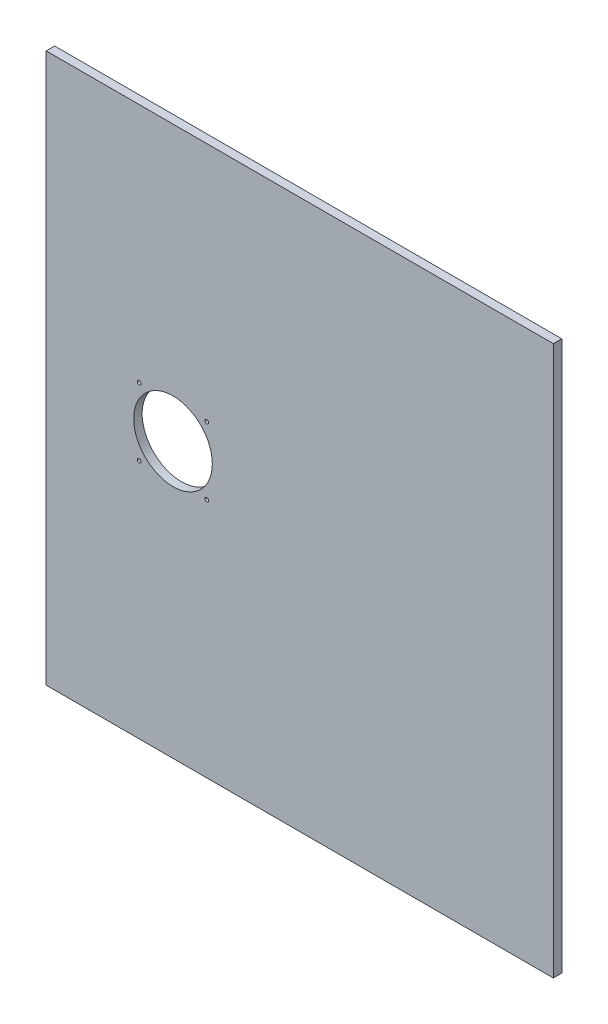
ISO-10303-21;
HEADER;
FILE_DESCRIPTION(('STEP AP214'),'2;1');
FILE_NAME('part.step','',(''),(''),'','','');
FILE_SCHEMA(('AUTOMOTIVE_DESIGN { 1 0 10303 214 1 1 1 1 }'));
ENDSEC;
DATA;
#1=APPLICATION_CONTEXT('core data for automotive mechanical design processes');
#2=APPLICATION_PROTOCOL_DEFINITION('international standard','automotive_design',2000,#1);
#3=PRODUCT_CONTEXT('',#1,'mechanical');
#4=PRODUCT('Part','Part','',(#3));
#5=PRODUCT_RELATED_PRODUCT_CATEGORY('part','',(#4));
#6=PRODUCT_DEFINITION_FORMATION('','',#4);
#7=PRODUCT_DEFINITION_CONTEXT('part definition',#1,'design');
#8=PRODUCT_DEFINITION('design','',#6,#7);
#9=PRODUCT_DEFINITION_SHAPE('','',#8);
#10=(LENGTH_UNIT() NAMED_UNIT(*) SI_UNIT(.MILLI.,.METRE.));
#11=(NAMED_UNIT(*) PLANE_ANGLE_UNIT() SI_UNIT($,.RADIAN.));
#12=(NAMED_UNIT(*) SI_UNIT($,.STERADIAN.) SOLID_ANGLE_UNIT());
#13=UNCERTAINTY_MEASURE_WITH_UNIT(LENGTH_MEASURE(1.E-05),#10,'distance_accuracy_value','');
#14=(GEOMETRIC_REPRESENTATION_CONTEXT(3) GLOBAL_UNCERTAINTY_ASSIGNED_CONTEXT((#13)) GLOBAL_UNIT_ASSIGNED_CONTEXT((#10,
#11,#12)) REPRESENTATION_CONTEXT('',''));
#15=CARTESIAN_POINT('',(0.,0.,0.));
#16=DIRECTION('',(0.,0.,1.));
#17=DIRECTION('',(1.,0.,0.));
#18=AXIS2_PLACEMENT_3D('',#15,#16,#17);
#19=CARTESIAN_POINT('',(0.,0.,10.));
#20=DIRECTION('',(1.,0.,0.));
#21=DIRECTION('',(0.,1.,0.));
#22=AXIS2_PLACEMENT_3D('',#19,#20,#21);
#23=PLANE('',#22);
#24=DIRECTION('',(0.,-1.,0.));
#25=VECTOR('',#24,1.);
#26=CARTESIAN_POINT('',(0.,0.,0.));
#27=LINE('',#26,#25);
#28=CARTESIAN_POINT('',(0.,0.,0.));
#29=VERTEX_POINT('',#28);
#30=CARTESIAN_POINT('',(0.,-650.,0.));
#31=VERTEX_POINT('',#30);
#32=EDGE_CURVE('E96',#29,#31,#27,.T.);
#33=ORIENTED_EDGE('',*,*,#32,.T.);
#34=DIRECTION('',(0.,0.,-1.));
#35=VECTOR('',#34,1.);
#36=CARTESIAN_POINT('',(0.,-650.,10.));
#37=LINE('',#36,#35);
#38=CARTESIAN_POINT('',(0.,-650.,10.));
#39=VERTEX_POINT('',#38);
#40=EDGE_CURVE('E11',#39,#31,#37,.T.);
#41=ORIENTED_EDGE('',*,*,#40,.F.);
#42=DIRECTION('',(0.,-1.,0.));
#43=VECTOR('',#42,1.);
#44=CARTESIAN_POINT('',(0.,0.,10.));
#45=LINE('',#44,#43);
#46=CARTESIAN_POINT('',(0.,0.,10.));
#47=VERTEX_POINT('',#46);
#48=EDGE_CURVE('E84',#47,#39,#45,.T.);
#49=ORIENTED_EDGE('',*,*,#48,.F.);
#50=DIRECTION('',(0.,0.,-1.));
#51=VECTOR('',#50,1.);
#52=CARTESIAN_POINT('',(0.,0.,10.));
#53=LINE('',#52,#51);
#54=EDGE_CURVE('E92',#47,#29,#53,.T.);
#55=ORIENTED_EDGE('',*,*,#54,.T.);
#56=EDGE_LOOP('',(#33,#41,#49,#55));
#57=FACE_BOUND('',#56,.T.);
#58=ADVANCED_FACE('F33',(#57),#23,.F.);
#59=CARTESIAN_POINT('',(0.,-650.,10.));
#60=DIRECTION('',(0.,1.,0.));
#61=DIRECTION('',(0.,0.,1.));
#62=AXIS2_PLACEMENT_3D('',#59,#60,#61);
#63=PLANE('',#62);
#64=DIRECTION('',(1.,0.,0.));
#65=VECTOR('',#64,1.);
#66=CARTESIAN_POINT('',(0.,-650.,0.));
#67=LINE('',#66,#65);
#68=CARTESIAN_POINT('',(600.,-650.,0.));
#69=VERTEX_POINT('',#68);
#70=EDGE_CURVE('E88',#31,#69,#67,.T.);
#71=ORIENTED_EDGE('',*,*,#70,.T.);
#72=DIRECTION('',(0.,0.,-1.));
#73=VECTOR('',#72,1.);
#74=CARTESIAN_POINT('',(600.,-650.,10.));
#75=LINE('',#74,#73);
#76=CARTESIAN_POINT('',(600.,-650.,10.));
#77=VERTEX_POINT('',#76);
#78=EDGE_CURVE('E41',#77,#69,#75,.T.);
#79=ORIENTED_EDGE('',*,*,#78,.F.);
#80=DIRECTION('',(1.,0.,0.));
#81=VECTOR('',#80,1.);
#82=CARTESIAN_POINT('',(0.,-650.,10.));
#83=LINE('',#82,#81);
#84=EDGE_CURVE('E79',#39,#77,#83,.T.);
#85=ORIENTED_EDGE('',*,*,#84,.F.);
#86=ORIENTED_EDGE('',*,*,#40,.T.);
#87=EDGE_LOOP('',(#71,#79,#85,#86));
#88=FACE_BOUND('',#87,.T.);
#89=ADVANCED_FACE('F87',(#88),#63,.F.);
#90=CARTESIAN_POINT('',(600.,0.,10.));
#91=DIRECTION('',(-1.,0.,0.));
#92=DIRECTION('',(0.,-1.,0.));
#93=AXIS2_PLACEMENT_3D('',#90,#91,#92);
#94=PLANE('',#93);
#95=DIRECTION('',(0.,1.,0.));
#96=VECTOR('',#95,1.);
#97=CARTESIAN_POINT('',(600.,0.,0.));
#98=LINE('',#97,#96);
#99=CARTESIAN_POINT('',(600.,0.,0.));
#100=VERTEX_POINT('',#99);
#101=EDGE_CURVE('E66',#69,#100,#98,.T.);
#102=ORIENTED_EDGE('',*,*,#101,.T.);
#103=DIRECTION('',(0.,0.,-1.));
#104=VECTOR('',#103,1.);
#105=CARTESIAN_POINT('',(600.,0.,10.));
#106=LINE('',#105,#104);
#107=CARTESIAN_POINT('',(600.,0.,10.));
#108=VERTEX_POINT('',#107);
#109=EDGE_CURVE('E89',#108,#100,#106,.T.);
#110=ORIENTED_EDGE('',*,*,#109,.F.);
#111=DIRECTION('',(0.,1.,0.));
#112=VECTOR('',#111,1.);
#113=CARTESIAN_POINT('',(600.,0.,10.));
#114=LINE('',#113,#112);
#115=EDGE_CURVE('E82',#77,#108,#114,.T.);
#116=ORIENTED_EDGE('',*,*,#115,.F.);
#117=ORIENTED_EDGE('',*,*,#78,.T.);
#118=EDGE_LOOP('',(#102,#110,#116,#117));
#119=FACE_BOUND('',#118,.T.);
#120=ADVANCED_FACE('F90',(#119),#94,.F.);
#121=CARTESIAN_POINT('',(0.,0.,10.));
#122=DIRECTION('',(0.,-1.,0.));
#123=DIRECTION('',(0.,0.,-1.));
#124=AXIS2_PLACEMENT_3D('',#121,#122,#123);
#125=PLANE('',#124);
#126=DIRECTION('',(-1.,0.,0.));
#127=VECTOR('',#126,1.);
#128=CARTESIAN_POINT('',(0.,0.,0.));
#129=LINE('',#128,#127);
#130=EDGE_CURVE('E72',#100,#29,#129,.T.);
#131=ORIENTED_EDGE('',*,*,#130,.T.);
#132=ORIENTED_EDGE('',*,*,#54,.F.);
#133=DIRECTION('',(-1.,0.,0.));
#134=VECTOR('',#133,1.);
#135=CARTESIAN_POINT('',(0.,0.,10.));
#136=LINE('',#135,#134);
#137=EDGE_CURVE('E49',#108,#47,#136,.T.);
#138=ORIENTED_EDGE('',*,*,#137,.F.);
#139=ORIENTED_EDGE('',*,*,#109,.T.);
#140=EDGE_LOOP('',(#131,#132,#138,#139));
#141=FACE_BOUND('',#140,.T.);
#142=ADVANCED_FACE('F104',(#141),#125,.F.);
#143=CARTESIAN_POINT('',(0.,0.,10.));
#144=DIRECTION('',(0.,0.,1.));
#145=DIRECTION('',(1.,0.,0.));
#146=AXIS2_PLACEMENT_3D('',#143,#144,#145);
#147=PLANE('',#146);
#148=CARTESIAN_POINT('',(110.,-285.,10.));
#149=DIRECTION('',(0.,0.,1.));
#150=DIRECTION('',(1.,0.,0.));
#151=AXIS2_PLACEMENT_3D('',#148,#149,#150);
#152=CIRCLE('',#151,2.25);
#153=CARTESIAN_POINT('',(112.25,-285.,10.));
#154=VERTEX_POINT('',#153);
#155=EDGE_CURVE('E134',#154,#154,#152,.T.);
#156=ORIENTED_EDGE('',*,*,#155,.F.);
#157=EDGE_LOOP('',(#156));
#158=FACE_BOUND('',#157,.T.);
#159=CARTESIAN_POINT('',(190.,-285.,10.));
#160=DIRECTION('',(0.,0.,1.));
#161=DIRECTION('',(1.,0.,0.));
#162=AXIS2_PLACEMENT_3D('',#159,#160,#161);
#163=CIRCLE('',#162,2.25000000000001);
#164=CARTESIAN_POINT('',(192.25,-285.,10.));
#165=VERTEX_POINT('',#164);
#166=EDGE_CURVE('E128',#165,#165,#163,.T.);
#167=ORIENTED_EDGE('',*,*,#166,.F.);
#168=EDGE_LOOP('',(#167));
#169=FACE_BOUND('',#168,.T.);
#170=CARTESIAN_POINT('',(190.,-365.,10.));
#171=DIRECTION('',(0.,0.,1.));
#172=DIRECTION('',(1.,0.,0.));
#173=AXIS2_PLACEMENT_3D('',#170,#171,#172);
#174=CIRCLE('',#173,2.24999999999996);
#175=CARTESIAN_POINT('',(192.25,-365.,10.));
#176=VERTEX_POINT('',#175);
#177=EDGE_CURVE('E122',#176,#176,#174,.T.);
#178=ORIENTED_EDGE('',*,*,#177,.F.);
#179=EDGE_LOOP('',(#178));
#180=FACE_BOUND('',#179,.T.);
#181=CARTESIAN_POINT('',(110.,-365.,10.));
#182=DIRECTION('',(0.,0.,1.));
#183=DIRECTION('',(1.,0.,0.));
#184=AXIS2_PLACEMENT_3D('',#181,#182,#183);
#185=CIRCLE('',#184,2.25);
#186=CARTESIAN_POINT('',(112.25,-365.,10.));
#187=VERTEX_POINT('',#186);
#188=EDGE_CURVE('E116',#187,#187,#185,.T.);
#189=ORIENTED_EDGE('',*,*,#188,.F.);
#190=EDGE_LOOP('',(#189));
#191=FACE_BOUND('',#190,.T.);
#192=CARTESIAN_POINT('',(150.,-325.,10.));
#193=DIRECTION('',(0.,0.,1.));
#194=DIRECTION('',(1.,0.,0.));
#195=AXIS2_PLACEMENT_3D('',#192,#193,#194);
#196=CIRCLE('',#195,46.5);
#197=CARTESIAN_POINT('',(196.5,-325.,10.));
#198=VERTEX_POINT('',#197);
#199=EDGE_CURVE('E110',#198,#198,#196,.T.);
#200=ORIENTED_EDGE('',*,*,#199,.F.);
#201=EDGE_LOOP('',(#200));
#202=FACE_BOUND('',#201,.T.);
#203=ORIENTED_EDGE('',*,*,#48,.T.);
#204=ORIENTED_EDGE('',*,*,#84,.T.);
#205=ORIENTED_EDGE('',*,*,#115,.T.);
#206=ORIENTED_EDGE('',*,*,#137,.T.);
#207=EDGE_LOOP('',(#203,#204,#205,#206));
#208=FACE_BOUND('',#207,.T.);
#209=ADVANCED_FACE('F80',(#158,#169,#180,#191,#202,#208),#147,.T.);
#210=CARTESIAN_POINT('',(0.,0.,0.));
#211=DIRECTION('',(0.,0.,1.));
#212=DIRECTION('',(1.,0.,0.));
#213=AXIS2_PLACEMENT_3D('',#210,#211,#212);
#214=PLANE('',#213);
#215=CARTESIAN_POINT('',(110.,-285.,0.));
#216=DIRECTION('',(0.,0.,1.));
#217=DIRECTION('',(1.,0.,0.));
#218=AXIS2_PLACEMENT_3D('',#215,#216,#217);
#219=CIRCLE('',#218,2.25);
#220=CARTESIAN_POINT('',(112.25,-285.,0.));
#221=VERTEX_POINT('',#220);
#222=EDGE_CURVE('E113',#221,#221,#219,.T.);
#223=ORIENTED_EDGE('',*,*,#222,.T.);
#224=EDGE_LOOP('',(#223));
#225=FACE_BOUND('',#224,.T.);
#226=CARTESIAN_POINT('',(190.,-285.,0.));
#227=DIRECTION('',(0.,0.,1.));
#228=DIRECTION('',(1.,0.,0.));
#229=AXIS2_PLACEMENT_3D('',#226,#227,#228);
#230=CIRCLE('',#229,2.25000000000001);
#231=CARTESIAN_POINT('',(192.25,-285.,0.));
#232=VERTEX_POINT('',#231);
#233=EDGE_CURVE('E131',#232,#232,#230,.T.);
#234=ORIENTED_EDGE('',*,*,#233,.T.);
#235=EDGE_LOOP('',(#234));
#236=FACE_BOUND('',#235,.T.);
#237=CARTESIAN_POINT('',(190.,-365.,0.));
#238=DIRECTION('',(0.,0.,1.));
#239=DIRECTION('',(1.,0.,0.));
#240=AXIS2_PLACEMENT_3D('',#237,#238,#239);
#241=CIRCLE('',#240,2.24999999999996);
#242=CARTESIAN_POINT('',(192.25,-365.,0.));
#243=VERTEX_POINT('',#242);
#244=EDGE_CURVE('E125',#243,#243,#241,.T.);
#245=ORIENTED_EDGE('',*,*,#244,.T.);
#246=EDGE_LOOP('',(#245));
#247=FACE_BOUND('',#246,.T.);
#248=CARTESIAN_POINT('',(110.,-365.,0.));
#249=DIRECTION('',(0.,0.,1.));
#250=DIRECTION('',(1.,0.,0.));
#251=AXIS2_PLACEMENT_3D('',#248,#249,#250);
#252=CIRCLE('',#251,2.25);
#253=CARTESIAN_POINT('',(112.25,-365.,0.));
#254=VERTEX_POINT('',#253);
#255=EDGE_CURVE('E119',#254,#254,#252,.T.);
#256=ORIENTED_EDGE('',*,*,#255,.T.);
#257=EDGE_LOOP('',(#256));
#258=FACE_BOUND('',#257,.T.);
#259=CARTESIAN_POINT('',(150.,-325.,0.));
#260=DIRECTION('',(0.,0.,1.));
#261=DIRECTION('',(1.,0.,0.));
#262=AXIS2_PLACEMENT_3D('',#259,#260,#261);
#263=CIRCLE('',#262,46.5);
#264=CARTESIAN_POINT('',(196.5,-325.,0.));
#265=VERTEX_POINT('',#264);
#266=EDGE_CURVE('E99',#265,#265,#263,.T.);
#267=ORIENTED_EDGE('',*,*,#266,.T.);
#268=EDGE_LOOP('',(#267));
#269=FACE_BOUND('',#268,.T.);
#270=ORIENTED_EDGE('',*,*,#32,.F.);
#271=ORIENTED_EDGE('',*,*,#130,.F.);
#272=ORIENTED_EDGE('',*,*,#101,.F.);
#273=ORIENTED_EDGE('',*,*,#70,.F.);
#274=EDGE_LOOP('',(#270,#271,#272,#273));
#275=FACE_BOUND('',#274,.T.);
#276=ADVANCED_FACE('F107',(#225,#236,#247,#258,#269,#275),#214,.F.);
#277=CARTESIAN_POINT('',(150.,-325.,0.));
#278=DIRECTION('',(0.,0.,1.));
#279=DIRECTION('',(1.,0.,0.));
#280=AXIS2_PLACEMENT_3D('',#277,#278,#279);
#281=CYLINDRICAL_SURFACE('',#280,46.5);
#282=ORIENTED_EDGE('',*,*,#266,.F.);
#283=EDGE_LOOP('',(#282));
#284=FACE_BOUND('',#283,.T.);
#285=ORIENTED_EDGE('',*,*,#199,.T.);
#286=EDGE_LOOP('',(#285));
#287=FACE_BOUND('',#286,.T.);
#288=ADVANCED_FACE('F160',(#284,#287),#281,.F.);
#289=CARTESIAN_POINT('',(110.,-365.,0.));
#290=DIRECTION('',(0.,0.,1.));
#291=DIRECTION('',(1.,0.,0.));
#292=AXIS2_PLACEMENT_3D('',#289,#290,#291);
#293=CYLINDRICAL_SURFACE('',#292,2.25);
#294=ORIENTED_EDGE('',*,*,#255,.F.);
#295=EDGE_LOOP('',(#294));
#296=FACE_BOUND('',#295,.T.);
#297=ORIENTED_EDGE('',*,*,#188,.T.);
#298=EDGE_LOOP('',(#297));
#299=FACE_BOUND('',#298,.T.);
#300=ADVANCED_FACE('F162',(#296,#299),#293,.F.);
#301=CARTESIAN_POINT('',(190.,-365.,0.));
#302=DIRECTION('',(0.,0.,1.));
#303=DIRECTION('',(1.,0.,0.));
#304=AXIS2_PLACEMENT_3D('',#301,#302,#303);
#305=CYLINDRICAL_SURFACE('',#304,2.24999999999996);
#306=ORIENTED_EDGE('',*,*,#244,.F.);
#307=EDGE_LOOP('',(#306));
#308=FACE_BOUND('',#307,.T.);
#309=ORIENTED_EDGE('',*,*,#177,.T.);
#310=EDGE_LOOP('',(#309));
#311=FACE_BOUND('',#310,.T.);
#312=ADVANCED_FACE('F169',(#308,#311),#305,.F.);
#313=CARTESIAN_POINT('',(190.,-285.,0.));
#314=DIRECTION('',(0.,0.,1.));
#315=DIRECTION('',(1.,0.,0.));
#316=AXIS2_PLACEMENT_3D('',#313,#314,#315);
#317=CYLINDRICAL_SURFACE('',#316,2.25000000000001);
#318=ORIENTED_EDGE('',*,*,#233,.F.);
#319=EDGE_LOOP('',(#318));
#320=FACE_BOUND('',#319,.T.);
#321=ORIENTED_EDGE('',*,*,#166,.T.);
#322=EDGE_LOOP('',(#321));
#323=FACE_BOUND('',#322,.T.);
#324=ADVANCED_FACE('F145',(#320,#323),#317,.F.);
#325=CARTESIAN_POINT('',(110.,-285.,0.));
#326=DIRECTION('',(0.,0.,1.));
#327=DIRECTION('',(1.,0.,0.));
#328=AXIS2_PLACEMENT_3D('',#325,#326,#327);
#329=CYLINDRICAL_SURFACE('',#328,2.25);
#330=ORIENTED_EDGE('',*,*,#222,.F.);
#331=EDGE_LOOP('',(#330));
#332=FACE_BOUND('',#331,.T.);
#333=ORIENTED_EDGE('',*,*,#155,.T.);
#334=EDGE_LOOP('',(#333));
#335=FACE_BOUND('',#334,.T.);
#336=ADVANCED_FACE('F142',(#332,#335),#329,.F.);
#337=CLOSED_SHELL('',(#58,#89,#120,#142,#209,#276,#288,#300,#312,#324,#336));
#338=MANIFOLD_SOLID_BREP('B2',#337);
#339=ADVANCED_BREP_SHAPE_REPRESENTATION('',(#18,#338),#14);
#340=SHAPE_DEFINITION_REPRESENTATION(#9,#339);
ENDSEC;
END-ISO-10303-21;
